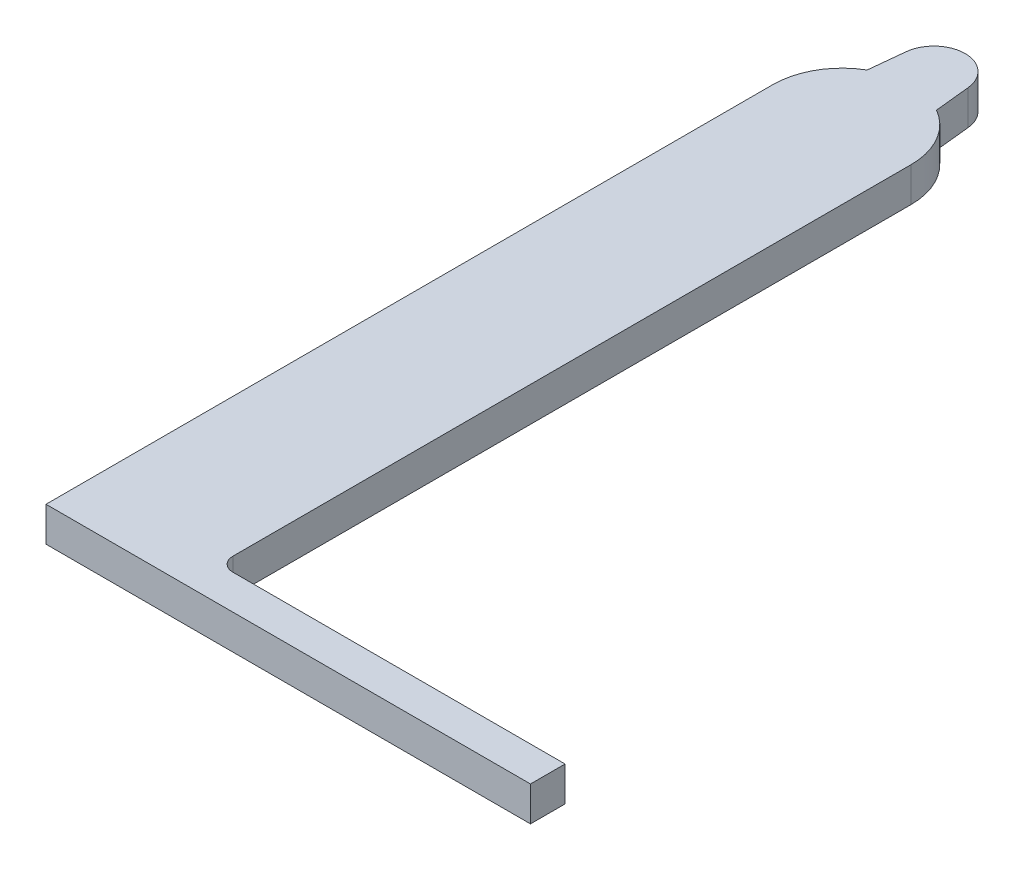
ISO-10303-21;
HEADER;
FILE_DESCRIPTION(('STEP AP214'),'2;1');
FILE_NAME('part.step','',(''),(''),'','','');
FILE_SCHEMA(('AUTOMOTIVE_DESIGN { 1 0 10303 214 1 1 1 1 }'));
ENDSEC;
DATA;
#1=APPLICATION_CONTEXT('core data for automotive mechanical design processes');
#2=APPLICATION_PROTOCOL_DEFINITION('international standard','automotive_design',2000,#1);
#3=PRODUCT_CONTEXT('',#1,'mechanical');
#4=PRODUCT('Part','Part','',(#3));
#5=PRODUCT_RELATED_PRODUCT_CATEGORY('part','',(#4));
#6=PRODUCT_DEFINITION_FORMATION('','',#4);
#7=PRODUCT_DEFINITION_CONTEXT('part definition',#1,'design');
#8=PRODUCT_DEFINITION('design','',#6,#7);
#9=PRODUCT_DEFINITION_SHAPE('','',#8);
#10=(LENGTH_UNIT() NAMED_UNIT(*) SI_UNIT(.MILLI.,.METRE.));
#11=(NAMED_UNIT(*) PLANE_ANGLE_UNIT() SI_UNIT($,.RADIAN.));
#12=(NAMED_UNIT(*) SI_UNIT($,.STERADIAN.) SOLID_ANGLE_UNIT());
#13=UNCERTAINTY_MEASURE_WITH_UNIT(LENGTH_MEASURE(1.E-05),#10,'distance_accuracy_value','');
#14=(GEOMETRIC_REPRESENTATION_CONTEXT(3) GLOBAL_UNCERTAINTY_ASSIGNED_CONTEXT((#13)) GLOBAL_UNIT_ASSIGNED_CONTEXT((#10,
#11,#12)) REPRESENTATION_CONTEXT('',''));
#15=CARTESIAN_POINT('',(0.,0.,0.));
#16=DIRECTION('',(0.,0.,1.));
#17=DIRECTION('',(1.,0.,0.));
#18=AXIS2_PLACEMENT_3D('',#15,#16,#17);
#19=CARTESIAN_POINT('',(0.,6.35,0.));
#20=DIRECTION('',(0.,-1.,0.));
#21=DIRECTION('',(0.,0.,-1.));
#22=AXIS2_PLACEMENT_3D('',#19,#20,#21);
#23=CYLINDRICAL_SURFACE('',#22,12.7);
#24=CARTESIAN_POINT('',(0.,6.35,0.));
#25=DIRECTION('',(0.,1.,0.));
#26=DIRECTION('',(0.,0.,1.));
#27=AXIS2_PLACEMENT_3D('',#24,#25,#26);
#28=CIRCLE('',#27,12.7);
#29=CARTESIAN_POINT('',(-6.37039518248316,6.35,-10.9867222236204));
#30=VERTEX_POINT('',#29);
#31=CARTESIAN_POINT('',(-12.7,6.35,0.));
#32=VERTEX_POINT('',#31);
#33=EDGE_CURVE('E189',#30,#32,#28,.T.);
#34=ORIENTED_EDGE('',*,*,#33,.F.);
#35=DIRECTION('',(0.,-1.,0.));
#36=VECTOR('',#35,1.);
#37=CARTESIAN_POINT('',(-6.37039518248316,6.35,-10.9867222236204));
#38=LINE('',#37,#36);
#39=CARTESIAN_POINT('',(-6.37039518248316,0.,-10.9867222236204));
#40=VERTEX_POINT('',#39);
#41=EDGE_CURVE('E146',#30,#40,#38,.T.);
#42=ORIENTED_EDGE('',*,*,#41,.T.);
#43=CARTESIAN_POINT('',(0.,0.,0.));
#44=DIRECTION('',(0.,1.,0.));
#45=DIRECTION('',(0.,0.,1.));
#46=AXIS2_PLACEMENT_3D('',#43,#44,#45);
#47=CIRCLE('',#46,12.7);
#48=CARTESIAN_POINT('',(-12.7,0.,0.));
#49=VERTEX_POINT('',#48);
#50=EDGE_CURVE('E185',#40,#49,#47,.T.);
#51=ORIENTED_EDGE('',*,*,#50,.T.);
#52=DIRECTION('',(0.,-1.,0.));
#53=VECTOR('',#52,1.);
#54=CARTESIAN_POINT('',(-12.7,6.35,0.));
#55=LINE('',#54,#53);
#56=EDGE_CURVE('E174',#32,#49,#55,.T.);
#57=ORIENTED_EDGE('',*,*,#56,.F.);
#58=EDGE_LOOP('',(#34,#42,#51,#57));
#59=FACE_BOUND('',#58,.T.);
#60=ADVANCED_FACE('F35',(#59),#23,.T.);
#61=CARTESIAN_POINT('',(12.7,6.35,0.));
#62=DIRECTION('',(1.,0.,0.));
#63=DIRECTION('',(0.,0.,-1.));
#64=AXIS2_PLACEMENT_3D('',#61,#62,#63);
#65=PLANE('',#64);
#66=DIRECTION('',(0.,0.,1.));
#67=VECTOR('',#66,1.);
#68=CARTESIAN_POINT('',(12.7,6.35,0.));
#69=LINE('',#68,#67);
#70=CARTESIAN_POINT('',(12.7,6.35,0.));
#71=VERTEX_POINT('',#70);
#72=CARTESIAN_POINT('',(12.7,6.35,124.46));
#73=VERTEX_POINT('',#72);
#74=EDGE_CURVE('E188',#71,#73,#69,.T.);
#75=ORIENTED_EDGE('',*,*,#74,.T.);
#76=DIRECTION('',(0.,-1.,0.));
#77=VECTOR('',#76,1.);
#78=CARTESIAN_POINT('',(12.7,0.,124.46));
#79=LINE('',#78,#77);
#80=CARTESIAN_POINT('',(12.7,0.,124.46));
#81=VERTEX_POINT('',#80);
#82=EDGE_CURVE('E161',#73,#81,#79,.T.);
#83=ORIENTED_EDGE('',*,*,#82,.T.);
#84=DIRECTION('',(0.,0.,1.));
#85=VECTOR('',#84,1.);
#86=CARTESIAN_POINT('',(12.7,0.,0.));
#87=LINE('',#86,#85);
#88=CARTESIAN_POINT('',(12.7,0.,0.));
#89=VERTEX_POINT('',#88);
#90=EDGE_CURVE('E183',#89,#81,#87,.T.);
#91=ORIENTED_EDGE('',*,*,#90,.F.);
#92=DIRECTION('',(0.,-1.,0.));
#93=VECTOR('',#92,1.);
#94=CARTESIAN_POINT('',(12.7,6.35,0.));
#95=LINE('',#94,#93);
#96=EDGE_CURVE('E169',#71,#89,#95,.T.);
#97=ORIENTED_EDGE('',*,*,#96,.F.);
#98=EDGE_LOOP('',(#75,#83,#91,#97));
#99=FACE_BOUND('',#98,.T.);
#100=ADVANCED_FACE('F240',(#99),#65,.T.);
#101=CARTESIAN_POINT('',(6.37039518248316,0.,-10.9867222236204));
#102=VERTEX_POINT('',#101);
#103=EDGE_CURVE('E195',#89,#102,#47,.T.);
#104=ORIENTED_EDGE('',*,*,#103,.T.);
#105=DIRECTION('',(0.,-1.,0.));
#106=VECTOR('',#105,1.);
#107=CARTESIAN_POINT('',(6.37039518248316,6.35,-10.9867222236204));
#108=LINE('',#107,#106);
#109=CARTESIAN_POINT('',(6.37039518248316,6.35,-10.9867222236204));
#110=VERTEX_POINT('',#109);
#111=EDGE_CURVE('E128',#102,#110,#108,.F.);
#112=ORIENTED_EDGE('',*,*,#111,.T.);
#113=EDGE_CURVE('E193',#71,#110,#28,.T.);
#114=ORIENTED_EDGE('',*,*,#113,.F.);
#115=ORIENTED_EDGE('',*,*,#96,.T.);
#116=EDGE_LOOP('',(#104,#112,#114,#115));
#117=FACE_BOUND('',#116,.T.);
#118=ADVANCED_FACE('F239',(#117),#23,.T.);
#119=CARTESIAN_POINT('',(-12.7,6.35,0.));
#120=DIRECTION('',(1.,0.,0.));
#121=DIRECTION('',(0.,0.,-1.));
#122=AXIS2_PLACEMENT_3D('',#119,#120,#121);
#123=PLANE('',#122);
#124=DIRECTION('',(0.,0.,1.));
#125=VECTOR('',#124,1.);
#126=CARTESIAN_POINT('',(-12.7,0.,0.));
#127=LINE('',#126,#125);
#128=CARTESIAN_POINT('',(-12.7,0.,133.35));
#129=VERTEX_POINT('',#128);
#130=EDGE_CURVE('E190',#49,#129,#127,.T.);
#131=ORIENTED_EDGE('',*,*,#130,.T.);
#132=DIRECTION('',(0.,1.,0.));
#133=VECTOR('',#132,1.);
#134=CARTESIAN_POINT('',(-12.7,-89.1264971823756,133.35));
#135=LINE('',#134,#133);
#136=CARTESIAN_POINT('',(-12.7,6.35,133.35));
#137=VERTEX_POINT('',#136);
#138=EDGE_CURVE('E207',#129,#137,#135,.T.);
#139=ORIENTED_EDGE('',*,*,#138,.T.);
#140=DIRECTION('',(0.,0.,1.));
#141=VECTOR('',#140,1.);
#142=CARTESIAN_POINT('',(-12.7,6.35,0.));
#143=LINE('',#142,#141);
#144=EDGE_CURVE('E179',#32,#137,#143,.T.);
#145=ORIENTED_EDGE('',*,*,#144,.F.);
#146=ORIENTED_EDGE('',*,*,#56,.T.);
#147=EDGE_LOOP('',(#131,#139,#145,#146));
#148=FACE_BOUND('',#147,.T.);
#149=ADVANCED_FACE('F217',(#148),#123,.F.);
#150=CARTESIAN_POINT('',(0.,6.35,0.));
#151=DIRECTION('',(0.,1.,0.));
#152=DIRECTION('',(0.,0.,1.));
#153=AXIS2_PLACEMENT_3D('',#150,#151,#152);
#154=PLANE('',#153);
#155=ORIENTED_EDGE('',*,*,#113,.T.);
#156=DIRECTION('',(0.10317527247145,0.,0.994663190809051));
#157=VECTOR('',#156,1.);
#158=CARTESIAN_POINT('',(7.38412422898595,6.35,-1.21384793061289));
#159=LINE('',#158,#157);
#160=CARTESIAN_POINT('',(5.69805563081873,6.35,-17.4684245515761));
#161=VERTEX_POINT('',#160);
#162=EDGE_CURVE('E50',#161,#110,#159,.T.);
#163=ORIENTED_EDGE('',*,*,#162,.F.);
#164=CARTESIAN_POINT('',(0.,6.35,-16.8773717734101));
#165=DIRECTION('',(0.,1.,0.));
#166=DIRECTION('',(0.,0.,1.));
#167=AXIS2_PLACEMENT_3D('',#164,#165,#166);
#168=CIRCLE('',#167,5.72862822658993);
#169=CARTESIAN_POINT('',(-5.69805563081874,6.35,-17.4684245515761));
#170=VERTEX_POINT('',#169);
#171=EDGE_CURVE('E123',#170,#161,#168,.F.);
#172=ORIENTED_EDGE('',*,*,#171,.F.);
#173=DIRECTION('',(0.10317527247145,0.,-0.994663190809051));
#174=VECTOR('',#173,1.);
#175=CARTESIAN_POINT('',(-5.69805563081874,6.35,-17.4684245515761));
#176=LINE('',#175,#174);
#177=EDGE_CURVE('E136',#30,#170,#176,.T.);
#178=ORIENTED_EDGE('',*,*,#177,.F.);
#179=ORIENTED_EDGE('',*,*,#33,.T.);
#180=ORIENTED_EDGE('',*,*,#144,.T.);
#181=DIRECTION('',(1.,0.,0.));
#182=VECTOR('',#181,1.);
#183=CARTESIAN_POINT('',(-12.7,6.35,133.35));
#184=LINE('',#183,#182);
#185=CARTESIAN_POINT('',(76.2,6.35,133.35));
#186=VERTEX_POINT('',#185);
#187=EDGE_CURVE('E149',#137,#186,#184,.T.);
#188=ORIENTED_EDGE('',*,*,#187,.T.);
#189=DIRECTION('',(0.,0.,-1.));
#190=VECTOR('',#189,1.);
#191=CARTESIAN_POINT('',(76.2,6.35,127.));
#192=LINE('',#191,#190);
#193=CARTESIAN_POINT('',(76.2,6.35,127.));
#194=VERTEX_POINT('',#193);
#195=EDGE_CURVE('E208',#186,#194,#192,.T.);
#196=ORIENTED_EDGE('',*,*,#195,.T.);
#197=DIRECTION('',(-1.,0.,0.));
#198=VECTOR('',#197,1.);
#199=CARTESIAN_POINT('',(-12.7,6.35,127.));
#200=LINE('',#199,#198);
#201=CARTESIAN_POINT('',(15.24,6.35,127.));
#202=VERTEX_POINT('',#201);
#203=EDGE_CURVE('E204',#194,#202,#200,.T.);
#204=ORIENTED_EDGE('',*,*,#203,.T.);
#205=CARTESIAN_POINT('',(15.24,6.35,124.46));
#206=DIRECTION('',(0.,1.,0.));
#207=DIRECTION('',(0.,0.,1.));
#208=AXIS2_PLACEMENT_3D('',#205,#206,#207);
#209=CIRCLE('',#208,2.54);
#210=EDGE_CURVE('E11',#202,#73,#209,.F.);
#211=ORIENTED_EDGE('',*,*,#210,.T.);
#212=ORIENTED_EDGE('',*,*,#74,.F.);
#213=EDGE_LOOP('',(#155,#163,#172,#178,#179,#180,#188,#196,#204,#211,#212));
#214=FACE_BOUND('',#213,.T.);
#215=ADVANCED_FACE('F226',(#214),#154,.T.);
#216=CARTESIAN_POINT('',(0.,0.,0.));
#217=DIRECTION('',(0.,1.,0.));
#218=DIRECTION('',(0.,0.,1.));
#219=AXIS2_PLACEMENT_3D('',#216,#217,#218);
#220=PLANE('',#219);
#221=ORIENTED_EDGE('',*,*,#50,.F.);
#222=DIRECTION('',(0.10317527247145,0.,-0.994663190809051));
#223=VECTOR('',#222,1.);
#224=CARTESIAN_POINT('',(-5.69805563081874,0.,-17.4684245515761));
#225=LINE('',#224,#223);
#226=CARTESIAN_POINT('',(-5.69805563081874,0.,-17.4684245515761));
#227=VERTEX_POINT('',#226);
#228=EDGE_CURVE('E131',#40,#227,#225,.T.);
#229=ORIENTED_EDGE('',*,*,#228,.T.);
#230=CARTESIAN_POINT('',(0.,0.,-16.8773717734101));
#231=DIRECTION('',(0.,-1.,0.));
#232=DIRECTION('',(0.,0.,-1.));
#233=AXIS2_PLACEMENT_3D('',#230,#231,#232);
#234=CIRCLE('',#233,5.72862822658993);
#235=CARTESIAN_POINT('',(5.69805563081873,0.,-17.4684245515761));
#236=VERTEX_POINT('',#235);
#237=EDGE_CURVE('E121',#227,#236,#234,.T.);
#238=ORIENTED_EDGE('',*,*,#237,.T.);
#239=DIRECTION('',(0.10317527247145,0.,0.994663190809051));
#240=VECTOR('',#239,1.);
#241=CARTESIAN_POINT('',(7.38412422898595,0.,-1.21384793061289));
#242=LINE('',#241,#240);
#243=EDGE_CURVE('E126',#236,#102,#242,.T.);
#244=ORIENTED_EDGE('',*,*,#243,.T.);
#245=ORIENTED_EDGE('',*,*,#103,.F.);
#246=ORIENTED_EDGE('',*,*,#90,.T.);
#247=CARTESIAN_POINT('',(15.24,0.,124.46));
#248=DIRECTION('',(0.,1.,0.));
#249=DIRECTION('',(0.,0.,1.));
#250=AXIS2_PLACEMENT_3D('',#247,#248,#249);
#251=CIRCLE('',#250,2.54);
#252=CARTESIAN_POINT('',(15.24,0.,127.));
#253=VERTEX_POINT('',#252);
#254=EDGE_CURVE('E43',#81,#253,#251,.T.);
#255=ORIENTED_EDGE('',*,*,#254,.T.);
#256=DIRECTION('',(1.,0.,0.));
#257=VECTOR('',#256,1.);
#258=CARTESIAN_POINT('',(-12.7,0.,127.));
#259=LINE('',#258,#257);
#260=CARTESIAN_POINT('',(76.2,0.,127.));
#261=VERTEX_POINT('',#260);
#262=EDGE_CURVE('E152',#253,#261,#259,.T.);
#263=ORIENTED_EDGE('',*,*,#262,.T.);
#264=DIRECTION('',(0.,0.,1.));
#265=VECTOR('',#264,1.);
#266=CARTESIAN_POINT('',(76.2,0.,127.));
#267=LINE('',#266,#265);
#268=CARTESIAN_POINT('',(76.2,0.,133.35));
#269=VERTEX_POINT('',#268);
#270=EDGE_CURVE('E150',#261,#269,#267,.T.);
#271=ORIENTED_EDGE('',*,*,#270,.T.);
#272=DIRECTION('',(-1.,0.,0.));
#273=VECTOR('',#272,1.);
#274=CARTESIAN_POINT('',(-12.7,0.,133.35));
#275=LINE('',#274,#273);
#276=EDGE_CURVE('E160',#269,#129,#275,.T.);
#277=ORIENTED_EDGE('',*,*,#276,.T.);
#278=ORIENTED_EDGE('',*,*,#130,.F.);
#279=EDGE_LOOP('',(#221,#229,#238,#244,#245,#246,#255,#263,#271,#277,#278));
#280=FACE_BOUND('',#279,.T.);
#281=ADVANCED_FACE('F134',(#280),#220,.F.);
#282=CARTESIAN_POINT('',(-12.7,-89.1264971823756,127.));
#283=DIRECTION('',(0.,0.,-1.));
#284=DIRECTION('',(-1.,0.,0.));
#285=AXIS2_PLACEMENT_3D('',#282,#283,#284);
#286=PLANE('',#285);
#287=ORIENTED_EDGE('',*,*,#262,.F.);
#288=DIRECTION('',(0.,-1.,0.));
#289=VECTOR('',#288,1.);
#290=CARTESIAN_POINT('',(15.24,6.35,127.));
#291=LINE('',#290,#289);
#292=EDGE_CURVE('E163',#253,#202,#291,.F.);
#293=ORIENTED_EDGE('',*,*,#292,.T.);
#294=ORIENTED_EDGE('',*,*,#203,.F.);
#295=DIRECTION('',(0.,1.,0.));
#296=VECTOR('',#295,1.);
#297=CARTESIAN_POINT('',(76.2,-89.1264971823756,127.));
#298=LINE('',#297,#296);
#299=EDGE_CURVE('E153',#261,#194,#298,.T.);
#300=ORIENTED_EDGE('',*,*,#299,.F.);
#301=EDGE_LOOP('',(#287,#293,#294,#300));
#302=FACE_BOUND('',#301,.T.);
#303=ADVANCED_FACE('F230',(#302),#286,.T.);
#304=CARTESIAN_POINT('',(76.2,-89.1264971823756,127.));
#305=DIRECTION('',(1.,0.,0.));
#306=DIRECTION('',(0.,0.,-1.));
#307=AXIS2_PLACEMENT_3D('',#304,#305,#306);
#308=PLANE('',#307);
#309=ORIENTED_EDGE('',*,*,#270,.F.);
#310=ORIENTED_EDGE('',*,*,#299,.T.);
#311=ORIENTED_EDGE('',*,*,#195,.F.);
#312=DIRECTION('',(0.,1.,0.));
#313=VECTOR('',#312,1.);
#314=CARTESIAN_POINT('',(76.2,-89.1264971823756,133.35));
#315=LINE('',#314,#313);
#316=EDGE_CURVE('E213',#269,#186,#315,.T.);
#317=ORIENTED_EDGE('',*,*,#316,.F.);
#318=EDGE_LOOP('',(#309,#310,#311,#317));
#319=FACE_BOUND('',#318,.T.);
#320=ADVANCED_FACE('F232',(#319),#308,.T.);
#321=CARTESIAN_POINT('',(-12.7,-89.1264971823756,133.35));
#322=DIRECTION('',(0.,0.,1.));
#323=DIRECTION('',(1.,0.,0.));
#324=AXIS2_PLACEMENT_3D('',#321,#322,#323);
#325=PLANE('',#324);
#326=ORIENTED_EDGE('',*,*,#276,.F.);
#327=ORIENTED_EDGE('',*,*,#316,.T.);
#328=ORIENTED_EDGE('',*,*,#187,.F.);
#329=ORIENTED_EDGE('',*,*,#138,.F.);
#330=EDGE_LOOP('',(#326,#327,#328,#329));
#331=FACE_BOUND('',#330,.T.);
#332=ADVANCED_FACE('F221',(#331),#325,.T.);
#333=CARTESIAN_POINT('',(15.24,6.35,124.46));
#334=DIRECTION('',(0.,1.,0.));
#335=DIRECTION('',(0.,0.,1.));
#336=AXIS2_PLACEMENT_3D('',#333,#334,#335);
#337=CYLINDRICAL_SURFACE('',#336,2.54);
#338=ORIENTED_EDGE('',*,*,#210,.F.);
#339=ORIENTED_EDGE('',*,*,#292,.F.);
#340=ORIENTED_EDGE('',*,*,#254,.F.);
#341=ORIENTED_EDGE('',*,*,#82,.F.);
#342=EDGE_LOOP('',(#338,#339,#340,#341));
#343=FACE_BOUND('',#342,.T.);
#344=ADVANCED_FACE('F37',(#343),#337,.F.);
#345=CARTESIAN_POINT('',(-5.69805563081874,32.3447173994289,-17.4684245515761));
#346=DIRECTION('',(-0.994663190809051,0.,-0.10317527247145));
#347=DIRECTION('',(-0.10317527247145,0.,0.994663190809051));
#348=AXIS2_PLACEMENT_3D('',#345,#346,#347);
#349=PLANE('',#348);
#350=ORIENTED_EDGE('',*,*,#41,.F.);
#351=ORIENTED_EDGE('',*,*,#177,.T.);
#352=DIRECTION('',(0.,-1.,0.));
#353=VECTOR('',#352,1.);
#354=CARTESIAN_POINT('',(-5.69805563081874,32.3447173994289,-17.4684245515761));
#355=LINE('',#354,#353);
#356=EDGE_CURVE('E138',#170,#227,#355,.T.);
#357=ORIENTED_EDGE('',*,*,#356,.T.);
#358=ORIENTED_EDGE('',*,*,#228,.F.);
#359=EDGE_LOOP('',(#350,#351,#357,#358));
#360=FACE_BOUND('',#359,.T.);
#361=ADVANCED_FACE('F238',(#360),#349,.T.);
#362=CARTESIAN_POINT('',(7.38412422898595,32.3447173994289,-1.21384793061289));
#363=DIRECTION('',(0.994663190809051,0.,-0.10317527247145));
#364=DIRECTION('',(-0.10317527247145,0.,-0.994663190809051));
#365=AXIS2_PLACEMENT_3D('',#362,#363,#364);
#366=PLANE('',#365);
#367=ORIENTED_EDGE('',*,*,#111,.F.);
#368=ORIENTED_EDGE('',*,*,#243,.F.);
#369=DIRECTION('',(0.,-1.,0.));
#370=VECTOR('',#369,1.);
#371=CARTESIAN_POINT('',(5.69805563081873,32.3447173994289,-17.4684245515761));
#372=LINE('',#371,#370);
#373=EDGE_CURVE('E116',#161,#236,#372,.T.);
#374=ORIENTED_EDGE('',*,*,#373,.F.);
#375=ORIENTED_EDGE('',*,*,#162,.T.);
#376=EDGE_LOOP('',(#367,#368,#374,#375));
#377=FACE_BOUND('',#376,.T.);
#378=ADVANCED_FACE('F127',(#377),#366,.T.);
#379=CARTESIAN_POINT('',(0.,32.3447173994289,-16.8773717734101));
#380=DIRECTION('',(0.,-1.,0.));
#381=DIRECTION('',(0.,0.,-1.));
#382=AXIS2_PLACEMENT_3D('',#379,#380,#381);
#383=CYLINDRICAL_SURFACE('',#382,5.72862822658993);
#384=ORIENTED_EDGE('',*,*,#356,.F.);
#385=ORIENTED_EDGE('',*,*,#171,.T.);
#386=ORIENTED_EDGE('',*,*,#373,.T.);
#387=ORIENTED_EDGE('',*,*,#237,.F.);
#388=EDGE_LOOP('',(#384,#385,#386,#387));
#389=FACE_BOUND('',#388,.T.);
#390=ADVANCED_FACE('F119',(#389),#383,.T.);
#391=CLOSED_SHELL('',(#60,#100,#118,#149,#215,#281,#303,#320,#332,#344,#361,#378,#390));
#392=MANIFOLD_SOLID_BREP('B2',#391);
#393=ADVANCED_BREP_SHAPE_REPRESENTATION('',(#18,#392),#14);
#394=SHAPE_DEFINITION_REPRESENTATION(#9,#393);
ENDSEC;
END-ISO-10303-21;
